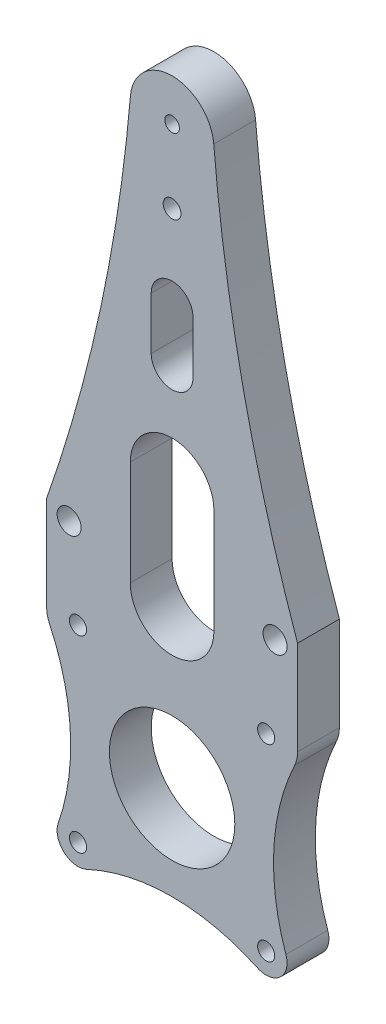
ISO-10303-21;
HEADER;
FILE_DESCRIPTION(('STEP AP214'),'2;1');
FILE_NAME('part.step','',(''),(''),'','','');
FILE_SCHEMA(('AUTOMOTIVE_DESIGN { 1 0 10303 214 1 1 1 1 }'));
ENDSEC;
DATA;
#1=APPLICATION_CONTEXT('core data for automotive mechanical design processes');
#2=APPLICATION_PROTOCOL_DEFINITION('international standard','automotive_design',2000,#1);
#3=PRODUCT_CONTEXT('',#1,'mechanical');
#4=PRODUCT('Part','Part','',(#3));
#5=PRODUCT_RELATED_PRODUCT_CATEGORY('part','',(#4));
#6=PRODUCT_DEFINITION_FORMATION('','',#4);
#7=PRODUCT_DEFINITION_CONTEXT('part definition',#1,'design');
#8=PRODUCT_DEFINITION('design','',#6,#7);
#9=PRODUCT_DEFINITION_SHAPE('','',#8);
#10=(LENGTH_UNIT() NAMED_UNIT(*) SI_UNIT(.MILLI.,.METRE.));
#11=(NAMED_UNIT(*) PLANE_ANGLE_UNIT() SI_UNIT($,.RADIAN.));
#12=(NAMED_UNIT(*) SI_UNIT($,.STERADIAN.) SOLID_ANGLE_UNIT());
#13=UNCERTAINTY_MEASURE_WITH_UNIT(LENGTH_MEASURE(1.E-05),#10,'distance_accuracy_value','');
#14=(GEOMETRIC_REPRESENTATION_CONTEXT(3) GLOBAL_UNCERTAINTY_ASSIGNED_CONTEXT((#13)) GLOBAL_UNIT_ASSIGNED_CONTEXT((#10,
#11,#12)) REPRESENTATION_CONTEXT('',''));
#15=CARTESIAN_POINT('',(0.,0.,0.));
#16=DIRECTION('',(0.,0.,1.));
#17=DIRECTION('',(1.,0.,0.));
#18=AXIS2_PLACEMENT_3D('',#15,#16,#17);
#19=CARTESIAN_POINT('',(0.,-20.,20.));
#20=DIRECTION('',(0.,0.,1.));
#21=DIRECTION('',(1.,0.,0.));
#22=AXIS2_PLACEMENT_3D('',#19,#20,#21);
#23=PLANE('',#22);
#24=CARTESIAN_POINT('',(0.,-20.,20.));
#25=DIRECTION('',(0.,0.,1.));
#26=DIRECTION('',(1.,0.,0.));
#27=AXIS2_PLACEMENT_3D('',#24,#25,#26);
#28=CIRCLE('',#27,3.5);
#29=CARTESIAN_POINT('',(3.5,-20.,20.));
#30=VERTEX_POINT('',#29);
#31=EDGE_CURVE('E618',#30,#30,#28,.T.);
#32=ORIENTED_EDGE('',*,*,#31,.F.);
#33=EDGE_LOOP('',(#32));
#34=FACE_BOUND('',#33,.T.);
#35=CARTESIAN_POINT('',(0.,-55.,20.));
#36=DIRECTION('',(0.,0.,1.));
#37=DIRECTION('',(1.,0.,0.));
#38=AXIS2_PLACEMENT_3D('',#35,#36,#37);
#39=CIRCLE('',#38,4.25);
#40=CARTESIAN_POINT('',(4.25,-55.,20.));
#41=VERTEX_POINT('',#40);
#42=EDGE_CURVE('E220',#41,#41,#39,.T.);
#43=ORIENTED_EDGE('',*,*,#42,.F.);
#44=EDGE_LOOP('',(#43));
#45=FACE_BOUND('',#44,.T.);
#46=CARTESIAN_POINT('',(0.,-120.,20.));
#47=DIRECTION('',(0.,0.,1.));
#48=DIRECTION('',(1.,0.,0.));
#49=AXIS2_PLACEMENT_3D('',#46,#47,#48);
#50=CIRCLE('',#49,10.);
#51=CARTESIAN_POINT('',(-10.,-120.,20.));
#52=VERTEX_POINT('',#51);
#53=CARTESIAN_POINT('',(10.,-120.,20.));
#54=VERTEX_POINT('',#53);
#55=EDGE_CURVE('E70',#52,#54,#50,.T.);
#56=ORIENTED_EDGE('',*,*,#55,.F.);
#57=DIRECTION('',(0.,-1.,0.));
#58=VECTOR('',#57,1.);
#59=CARTESIAN_POINT('',(-10.,-120.,20.));
#60=LINE('',#59,#58);
#61=CARTESIAN_POINT('',(-10.,-94.9999999999999,20.));
#62=VERTEX_POINT('',#61);
#63=EDGE_CURVE('E213',#62,#52,#60,.T.);
#64=ORIENTED_EDGE('',*,*,#63,.F.);
#65=CARTESIAN_POINT('',(0.,-94.9999999999999,20.));
#66=DIRECTION('',(0.,0.,1.));
#67=DIRECTION('',(1.,0.,0.));
#68=AXIS2_PLACEMENT_3D('',#65,#66,#67);
#69=CIRCLE('',#68,10.);
#70=CARTESIAN_POINT('',(10.,-94.9999999999999,20.));
#71=VERTEX_POINT('',#70);
#72=EDGE_CURVE('E217',#71,#62,#69,.T.);
#73=ORIENTED_EDGE('',*,*,#72,.F.);
#74=DIRECTION('',(0.,1.,0.));
#75=VECTOR('',#74,1.);
#76=CARTESIAN_POINT('',(10.,-120.,20.));
#77=LINE('',#76,#75);
#78=EDGE_CURVE('E229',#54,#71,#77,.T.);
#79=ORIENTED_EDGE('',*,*,#78,.F.);
#80=EDGE_LOOP('',(#56,#64,#73,#79));
#81=FACE_BOUND('',#80,.T.);
#82=CARTESIAN_POINT('',(0.,-220.,20.));
#83=DIRECTION('',(0.,0.,1.));
#84=DIRECTION('',(1.,0.,0.));
#85=AXIS2_PLACEMENT_3D('',#82,#83,#84);
#86=CIRCLE('',#85,20.);
#87=CARTESIAN_POINT('',(-20.,-220.,20.));
#88=VERTEX_POINT('',#87);
#89=CARTESIAN_POINT('',(20.,-220.,20.));
#90=VERTEX_POINT('',#89);
#91=EDGE_CURVE('E239',#88,#90,#86,.T.);
#92=ORIENTED_EDGE('',*,*,#91,.F.);
#93=DIRECTION('',(0.,-1.,0.));
#94=VECTOR('',#93,1.);
#95=CARTESIAN_POINT('',(-20.,-220.,20.));
#96=LINE('',#95,#94);
#97=CARTESIAN_POINT('',(-20.,-170.,20.));
#98=VERTEX_POINT('',#97);
#99=EDGE_CURVE('E250',#98,#88,#96,.T.);
#100=ORIENTED_EDGE('',*,*,#99,.F.);
#101=CARTESIAN_POINT('',(0.,-170.,20.));
#102=DIRECTION('',(0.,0.,1.));
#103=DIRECTION('',(1.,0.,0.));
#104=AXIS2_PLACEMENT_3D('',#101,#102,#103);
#105=CIRCLE('',#104,20.);
#106=CARTESIAN_POINT('',(20.,-170.,20.));
#107=VERTEX_POINT('',#106);
#108=EDGE_CURVE('E269',#107,#98,#105,.T.);
#109=ORIENTED_EDGE('',*,*,#108,.F.);
#110=DIRECTION('',(0.,1.,0.));
#111=VECTOR('',#110,1.);
#112=CARTESIAN_POINT('',(20.,-220.,20.));
#113=LINE('',#112,#111);
#114=EDGE_CURVE('E265',#90,#107,#113,.T.);
#115=ORIENTED_EDGE('',*,*,#114,.F.);
#116=EDGE_LOOP('',(#92,#100,#109,#115));
#117=FACE_BOUND('',#116,.T.);
#118=CARTESIAN_POINT('',(0.,-295.,20.));
#119=DIRECTION('',(0.,0.,1.));
#120=DIRECTION('',(1.,0.,0.));
#121=AXIS2_PLACEMENT_3D('',#118,#119,#120);
#122=CIRCLE('',#121,30.);
#123=CARTESIAN_POINT('',(30.,-295.,20.));
#124=VERTEX_POINT('',#123);
#125=EDGE_CURVE('E279',#124,#124,#122,.T.);
#126=ORIENTED_EDGE('',*,*,#125,.F.);
#127=EDGE_LOOP('',(#126));
#128=FACE_BOUND('',#127,.T.);
#129=CARTESIAN_POINT('',(-45.,-250.,20.));
#130=DIRECTION('',(0.,0.,1.));
#131=DIRECTION('',(1.,0.,0.));
#132=AXIS2_PLACEMENT_3D('',#129,#130,#131);
#133=CIRCLE('',#132,4.1);
#134=CARTESIAN_POINT('',(-40.9,-250.,20.));
#135=VERTEX_POINT('',#134);
#136=EDGE_CURVE('E389',#135,#135,#133,.T.);
#137=ORIENTED_EDGE('',*,*,#136,.F.);
#138=EDGE_LOOP('',(#137));
#139=FACE_BOUND('',#138,.T.);
#140=CARTESIAN_POINT('',(0.,-20.,20.));
#141=DIRECTION('',(0.,0.,1.));
#142=DIRECTION('',(1.,0.,0.));
#143=AXIS2_PLACEMENT_3D('',#140,#141,#142);
#144=CIRCLE('',#143,19.9999999999998);
#145=CARTESIAN_POINT('',(19.9262463817534,-18.2839856837292,20.));
#146=VERTEX_POINT('',#145);
#147=CARTESIAN_POINT('',(-19.9262463817534,-18.2839856837292,20.));
#148=VERTEX_POINT('',#147);
#149=EDGE_CURVE('E405',#146,#148,#144,.T.);
#150=ORIENTED_EDGE('',*,*,#149,.T.);
#151=CARTESIAN_POINT('',(-779.879569235867,47.1618969341376,20.));
#152=DIRECTION('',(0.,0.,-1.));
#153=DIRECTION('',(-1.,0.,0.));
#154=AXIS2_PLACEMENT_3D('',#151,#152,#153);
#155=CIRCLE('',#154,762.766161066837);
#156=CARTESIAN_POINT('',(-60.,-205.,20.));
#157=VERTEX_POINT('',#156);
#158=EDGE_CURVE('E409',#148,#157,#155,.T.);
#159=ORIENTED_EDGE('',*,*,#158,.T.);
#160=DIRECTION('',(0.,-1.,0.));
#161=VECTOR('',#160,1.);
#162=CARTESIAN_POINT('',(-60.,-250.,20.));
#163=LINE('',#162,#161);
#164=CARTESIAN_POINT('',(-60.,-250.,20.));
#165=VERTEX_POINT('',#164);
#166=EDGE_CURVE('E413',#157,#165,#163,.T.);
#167=ORIENTED_EDGE('',*,*,#166,.T.);
#168=CARTESIAN_POINT('',(-45.,-250.,20.));
#169=DIRECTION('',(0.,0.,1.));
#170=DIRECTION('',(-1.,0.,0.));
#171=AXIS2_PLACEMENT_3D('',#168,#169,#170);
#172=CIRCLE('',#171,15.);
#173=CARTESIAN_POINT('',(-58.5812321969071,-256.367898555544,20.));
#174=VERTEX_POINT('',#173);
#175=EDGE_CURVE('E416',#165,#174,#172,.T.);
#176=ORIENTED_EDGE('',*,*,#175,.T.);
#177=CARTESIAN_POINT('',(-155.084377389979,-301.615798743888,20.));
#178=DIRECTION('',(0.,0.,-1.));
#179=DIRECTION('',(1.,0.,0.));
#180=AXIS2_PLACEMENT_3D('',#177,#178,#179);
#181=CIRCLE('',#180,106.584377389979);
#182=CARTESIAN_POINT('',(-54.4424638922025,-336.707603358577,20.));
#183=VERTEX_POINT('',#182);
#184=EDGE_CURVE('E419',#174,#183,#181,.T.);
#185=ORIENTED_EDGE('',*,*,#184,.T.);
#186=CARTESIAN_POINT('',(-45.,-340.,20.));
#187=DIRECTION('',(0.,0.,1.));
#188=DIRECTION('',(-1.,0.,0.));
#189=AXIS2_PLACEMENT_3D('',#186,#187,#188);
#190=CIRCLE('',#189,10.);
#191=CARTESIAN_POINT('',(-40.7647058823529,-349.058823529412,20.));
#192=VERTEX_POINT('',#191);
#193=EDGE_CURVE('E422',#183,#192,#190,.T.);
#194=ORIENTED_EDGE('',*,*,#193,.T.);
#195=CARTESIAN_POINT('',(0.,-436.25,20.));
#196=DIRECTION('',(0.,0.,-1.));
#197=DIRECTION('',(1.,0.,0.));
#198=AXIS2_PLACEMENT_3D('',#195,#196,#197);
#199=CIRCLE('',#198,96.25);
#200=CARTESIAN_POINT('',(40.7647058823529,-349.058823529412,20.));
#201=VERTEX_POINT('',#200);
#202=EDGE_CURVE('E425',#192,#201,#199,.T.);
#203=ORIENTED_EDGE('',*,*,#202,.T.);
#204=CARTESIAN_POINT('',(45.,-340.,20.));
#205=DIRECTION('',(0.,0.,-1.));
#206=DIRECTION('',(1.,0.,0.));
#207=AXIS2_PLACEMENT_3D('',#204,#205,#206);
#208=CIRCLE('',#207,10.);
#209=CARTESIAN_POINT('',(54.4424638922025,-336.707603358577,20.));
#210=VERTEX_POINT('',#209);
#211=EDGE_CURVE('E321',#210,#201,#208,.T.);
#212=ORIENTED_EDGE('',*,*,#211,.F.);
#213=CARTESIAN_POINT('',(155.084377389979,-301.615798743888,20.));
#214=DIRECTION('',(0.,0.,1.));
#215=DIRECTION('',(-1.,0.,0.));
#216=AXIS2_PLACEMENT_3D('',#213,#214,#215);
#217=CIRCLE('',#216,106.584377389979);
#218=CARTESIAN_POINT('',(58.5812321969071,-256.367898555544,20.));
#219=VERTEX_POINT('',#218);
#220=EDGE_CURVE('E325',#219,#210,#217,.T.);
#221=ORIENTED_EDGE('',*,*,#220,.F.);
#222=CARTESIAN_POINT('',(45.,-250.,20.));
#223=DIRECTION('',(0.,0.,-1.));
#224=DIRECTION('',(1.,0.,0.));
#225=AXIS2_PLACEMENT_3D('',#222,#223,#224);
#226=CIRCLE('',#225,15.);
#227=CARTESIAN_POINT('',(60.,-250.,20.));
#228=VERTEX_POINT('',#227);
#229=EDGE_CURVE('E330',#228,#219,#226,.T.);
#230=ORIENTED_EDGE('',*,*,#229,.F.);
#231=DIRECTION('',(0.,-1.,0.));
#232=VECTOR('',#231,1.);
#233=CARTESIAN_POINT('',(60.,-250.,20.));
#234=LINE('',#233,#232);
#235=CARTESIAN_POINT('',(60.,-205.,20.));
#236=VERTEX_POINT('',#235);
#237=EDGE_CURVE('E334',#236,#228,#234,.T.);
#238=ORIENTED_EDGE('',*,*,#237,.F.);
#239=CARTESIAN_POINT('',(779.879569235867,47.1618969341376,20.));
#240=DIRECTION('',(0.,0.,1.));
#241=DIRECTION('',(1.,0.,0.));
#242=AXIS2_PLACEMENT_3D('',#239,#240,#241);
#243=CIRCLE('',#242,762.766161066837);
#244=EDGE_CURVE('E338',#146,#236,#243,.T.);
#245=ORIENTED_EDGE('',*,*,#244,.F.);
#246=EDGE_LOOP('',(#150,#159,#167,#176,#185,#194,#203,#212,#221,#230,#238,#245));
#247=FACE_BOUND('',#246,.T.);
#248=CARTESIAN_POINT('',(-45.,-340.,20.));
#249=DIRECTION('',(0.,0.,1.));
#250=DIRECTION('',(1.,0.,0.));
#251=AXIS2_PLACEMENT_3D('',#248,#249,#250);
#252=CIRCLE('',#251,4.1);
#253=CARTESIAN_POINT('',(-40.9,-340.,20.));
#254=VERTEX_POINT('',#253);
#255=EDGE_CURVE('E397',#254,#254,#252,.T.);
#256=ORIENTED_EDGE('',*,*,#255,.F.);
#257=EDGE_LOOP('',(#256));
#258=FACE_BOUND('',#257,.T.);
#259=CARTESIAN_POINT('',(-49.25,-209.,20.));
#260=DIRECTION('',(0.,0.,1.));
#261=DIRECTION('',(1.,0.,0.));
#262=AXIS2_PLACEMENT_3D('',#259,#260,#261);
#263=CIRCLE('',#262,5.75);
#264=CARTESIAN_POINT('',(-43.5,-209.,20.));
#265=VERTEX_POINT('',#264);
#266=EDGE_CURVE('E381',#265,#265,#263,.T.);
#267=ORIENTED_EDGE('',*,*,#266,.F.);
#268=EDGE_LOOP('',(#267));
#269=FACE_BOUND('',#268,.T.);
#270=CARTESIAN_POINT('',(49.25,-209.,20.));
#271=DIRECTION('',(0.,0.,-1.));
#272=DIRECTION('',(-1.,0.,0.));
#273=AXIS2_PLACEMENT_3D('',#270,#271,#272);
#274=CIRCLE('',#273,5.75);
#275=CARTESIAN_POINT('',(43.5,-209.,20.));
#276=VERTEX_POINT('',#275);
#277=EDGE_CURVE('E297',#276,#276,#274,.T.);
#278=ORIENTED_EDGE('',*,*,#277,.T.);
#279=EDGE_LOOP('',(#278));
#280=FACE_BOUND('',#279,.T.);
#281=CARTESIAN_POINT('',(45.,-250.,20.));
#282=DIRECTION('',(0.,0.,-1.));
#283=DIRECTION('',(-1.,0.,0.));
#284=AXIS2_PLACEMENT_3D('',#281,#282,#283);
#285=CIRCLE('',#284,4.1);
#286=CARTESIAN_POINT('',(40.9,-250.,20.));
#287=VERTEX_POINT('',#286);
#288=EDGE_CURVE('E305',#287,#287,#285,.T.);
#289=ORIENTED_EDGE('',*,*,#288,.T.);
#290=EDGE_LOOP('',(#289));
#291=FACE_BOUND('',#290,.T.);
#292=CARTESIAN_POINT('',(45.,-340.,20.));
#293=DIRECTION('',(0.,0.,-1.));
#294=DIRECTION('',(-1.,0.,0.));
#295=AXIS2_PLACEMENT_3D('',#292,#293,#294);
#296=CIRCLE('',#295,4.1);
#297=CARTESIAN_POINT('',(40.9,-340.,20.));
#298=VERTEX_POINT('',#297);
#299=EDGE_CURVE('E313',#298,#298,#296,.T.);
#300=ORIENTED_EDGE('',*,*,#299,.T.);
#301=EDGE_LOOP('',(#300));
#302=FACE_BOUND('',#301,.T.);
#303=ADVANCED_FACE('F54',(#34,#45,#81,#117,#128,#139,#247,#258,#269,#280,#291,#302),#23,.T.);
#304=CARTESIAN_POINT('',(0.,-20.,0.));
#305=DIRECTION('',(0.,0.,1.));
#306=DIRECTION('',(1.,0.,0.));
#307=AXIS2_PLACEMENT_3D('',#304,#305,#306);
#308=PLANE('',#307);
#309=CARTESIAN_POINT('',(0.,-20.,0.));
#310=DIRECTION('',(0.,0.,1.));
#311=DIRECTION('',(1.,0.,0.));
#312=AXIS2_PLACEMENT_3D('',#309,#310,#311);
#313=CIRCLE('',#312,3.5);
#314=CARTESIAN_POINT('',(3.5,-20.,0.));
#315=VERTEX_POINT('',#314);
#316=EDGE_CURVE('E616',#315,#315,#313,.T.);
#317=ORIENTED_EDGE('',*,*,#316,.T.);
#318=EDGE_LOOP('',(#317));
#319=FACE_BOUND('',#318,.T.);
#320=CARTESIAN_POINT('',(0.,-55.,0.));
#321=DIRECTION('',(0.,0.,1.));
#322=DIRECTION('',(1.,0.,0.));
#323=AXIS2_PLACEMENT_3D('',#320,#321,#322);
#324=CIRCLE('',#323,4.25);
#325=CARTESIAN_POINT('',(4.25,-55.,0.));
#326=VERTEX_POINT('',#325);
#327=EDGE_CURVE('E230',#326,#326,#324,.T.);
#328=ORIENTED_EDGE('',*,*,#327,.T.);
#329=EDGE_LOOP('',(#328));
#330=FACE_BOUND('',#329,.T.);
#331=DIRECTION('',(0.,-1.,0.));
#332=VECTOR('',#331,1.);
#333=CARTESIAN_POINT('',(-10.,-120.,0.));
#334=LINE('',#333,#332);
#335=CARTESIAN_POINT('',(-10.,-94.9999999999999,0.));
#336=VERTEX_POINT('',#335);
#337=CARTESIAN_POINT('',(-10.,-120.,0.));
#338=VERTEX_POINT('',#337);
#339=EDGE_CURVE('E201',#336,#338,#334,.T.);
#340=ORIENTED_EDGE('',*,*,#339,.T.);
#341=CARTESIAN_POINT('',(0.,-120.,0.));
#342=DIRECTION('',(0.,0.,1.));
#343=DIRECTION('',(1.,0.,0.));
#344=AXIS2_PLACEMENT_3D('',#341,#342,#343);
#345=CIRCLE('',#344,10.);
#346=CARTESIAN_POINT('',(10.,-120.,0.));
#347=VERTEX_POINT('',#346);
#348=EDGE_CURVE('E194',#338,#347,#345,.T.);
#349=ORIENTED_EDGE('',*,*,#348,.T.);
#350=DIRECTION('',(0.,1.,0.));
#351=VECTOR('',#350,1.);
#352=CARTESIAN_POINT('',(10.,-120.,0.));
#353=LINE('',#352,#351);
#354=CARTESIAN_POINT('',(10.,-94.9999999999999,0.));
#355=VERTEX_POINT('',#354);
#356=EDGE_CURVE('E204',#347,#355,#353,.T.);
#357=ORIENTED_EDGE('',*,*,#356,.T.);
#358=CARTESIAN_POINT('',(0.,-94.9999999999999,0.));
#359=DIRECTION('',(0.,0.,1.));
#360=DIRECTION('',(1.,0.,0.));
#361=AXIS2_PLACEMENT_3D('',#358,#359,#360);
#362=CIRCLE('',#361,10.);
#363=EDGE_CURVE('E78',#355,#336,#362,.T.);
#364=ORIENTED_EDGE('',*,*,#363,.T.);
#365=EDGE_LOOP('',(#340,#349,#357,#364));
#366=FACE_BOUND('',#365,.T.);
#367=DIRECTION('',(0.,-1.,0.));
#368=VECTOR('',#367,1.);
#369=CARTESIAN_POINT('',(-20.,-220.,0.));
#370=LINE('',#369,#368);
#371=CARTESIAN_POINT('',(-20.,-170.,0.));
#372=VERTEX_POINT('',#371);
#373=CARTESIAN_POINT('',(-20.,-220.,0.));
#374=VERTEX_POINT('',#373);
#375=EDGE_CURVE('E258',#372,#374,#370,.T.);
#376=ORIENTED_EDGE('',*,*,#375,.T.);
#377=CARTESIAN_POINT('',(0.,-220.,0.));
#378=DIRECTION('',(0.,0.,1.));
#379=DIRECTION('',(1.,0.,0.));
#380=AXIS2_PLACEMENT_3D('',#377,#378,#379);
#381=CIRCLE('',#380,20.);
#382=CARTESIAN_POINT('',(20.,-220.,0.));
#383=VERTEX_POINT('',#382);
#384=EDGE_CURVE('E245',#374,#383,#381,.T.);
#385=ORIENTED_EDGE('',*,*,#384,.T.);
#386=DIRECTION('',(0.,1.,0.));
#387=VECTOR('',#386,1.);
#388=CARTESIAN_POINT('',(20.,-220.,0.));
#389=LINE('',#388,#387);
#390=CARTESIAN_POINT('',(20.,-170.,0.));
#391=VERTEX_POINT('',#390);
#392=EDGE_CURVE('E249',#383,#391,#389,.T.);
#393=ORIENTED_EDGE('',*,*,#392,.T.);
#394=CARTESIAN_POINT('',(0.,-170.,0.));
#395=DIRECTION('',(0.,0.,1.));
#396=DIRECTION('',(1.,0.,0.));
#397=AXIS2_PLACEMENT_3D('',#394,#395,#396);
#398=CIRCLE('',#397,20.);
#399=EDGE_CURVE('E254',#391,#372,#398,.T.);
#400=ORIENTED_EDGE('',*,*,#399,.T.);
#401=EDGE_LOOP('',(#376,#385,#393,#400));
#402=FACE_BOUND('',#401,.T.);
#403=CARTESIAN_POINT('',(0.,-295.,0.));
#404=DIRECTION('',(0.,0.,1.));
#405=DIRECTION('',(1.,0.,0.));
#406=AXIS2_PLACEMENT_3D('',#403,#404,#405);
#407=CIRCLE('',#406,30.);
#408=CARTESIAN_POINT('',(30.,-295.,0.));
#409=VERTEX_POINT('',#408);
#410=EDGE_CURVE('E289',#409,#409,#407,.T.);
#411=ORIENTED_EDGE('',*,*,#410,.T.);
#412=EDGE_LOOP('',(#411));
#413=FACE_BOUND('',#412,.T.);
#414=CARTESIAN_POINT('',(0.,-20.,0.));
#415=DIRECTION('',(0.,0.,1.));
#416=DIRECTION('',(1.,0.,0.));
#417=AXIS2_PLACEMENT_3D('',#414,#415,#416);
#418=CIRCLE('',#417,19.9999999999998);
#419=CARTESIAN_POINT('',(19.9262463817534,-18.2839856837292,0.));
#420=VERTEX_POINT('',#419);
#421=CARTESIAN_POINT('',(-19.9262463817534,-18.2839856837292,0.));
#422=VERTEX_POINT('',#421);
#423=EDGE_CURVE('E401',#420,#422,#418,.T.);
#424=ORIENTED_EDGE('',*,*,#423,.F.);
#425=CARTESIAN_POINT('',(779.879569235867,47.1618969341376,0.));
#426=DIRECTION('',(0.,0.,1.));
#427=DIRECTION('',(1.,0.,0.));
#428=AXIS2_PLACEMENT_3D('',#425,#426,#427);
#429=CIRCLE('',#428,762.766161066837);
#430=CARTESIAN_POINT('',(60.,-205.,0.));
#431=VERTEX_POINT('',#430);
#432=EDGE_CURVE('E326',#420,#431,#429,.T.);
#433=ORIENTED_EDGE('',*,*,#432,.T.);
#434=DIRECTION('',(0.,-1.,0.));
#435=VECTOR('',#434,1.);
#436=CARTESIAN_POINT('',(60.,-250.,0.));
#437=LINE('',#436,#435);
#438=CARTESIAN_POINT('',(60.,-250.,0.));
#439=VERTEX_POINT('',#438);
#440=EDGE_CURVE('E354',#431,#439,#437,.T.);
#441=ORIENTED_EDGE('',*,*,#440,.T.);
#442=CARTESIAN_POINT('',(45.,-250.,0.));
#443=DIRECTION('',(0.,0.,-1.));
#444=DIRECTION('',(1.,0.,0.));
#445=AXIS2_PLACEMENT_3D('',#442,#443,#444);
#446=CIRCLE('',#445,15.);
#447=CARTESIAN_POINT('',(58.5812321969071,-256.367898555544,0.));
#448=VERTEX_POINT('',#447);
#449=EDGE_CURVE('E350',#439,#448,#446,.T.);
#450=ORIENTED_EDGE('',*,*,#449,.T.);
#451=CARTESIAN_POINT('',(155.084377389979,-301.615798743888,0.));
#452=DIRECTION('',(0.,0.,1.));
#453=DIRECTION('',(-1.,0.,0.));
#454=AXIS2_PLACEMENT_3D('',#451,#452,#453);
#455=CIRCLE('',#454,106.584377389979);
#456=CARTESIAN_POINT('',(54.4424638922025,-336.707603358577,0.));
#457=VERTEX_POINT('',#456);
#458=EDGE_CURVE('E346',#448,#457,#455,.T.);
#459=ORIENTED_EDGE('',*,*,#458,.T.);
#460=CARTESIAN_POINT('',(45.,-340.,0.));
#461=DIRECTION('',(0.,0.,-1.));
#462=DIRECTION('',(1.,0.,0.));
#463=AXIS2_PLACEMENT_3D('',#460,#461,#462);
#464=CIRCLE('',#463,10.);
#465=CARTESIAN_POINT('',(40.7647058823529,-349.058823529412,0.));
#466=VERTEX_POINT('',#465);
#467=EDGE_CURVE('E317',#457,#466,#464,.T.);
#468=ORIENTED_EDGE('',*,*,#467,.T.);
#469=CARTESIAN_POINT('',(0.,-436.25,0.));
#470=DIRECTION('',(0.,0.,-1.));
#471=DIRECTION('',(1.,0.,0.));
#472=AXIS2_PLACEMENT_3D('',#469,#470,#471);
#473=CIRCLE('',#472,96.25);
#474=CARTESIAN_POINT('',(-40.7647058823529,-349.058823529412,0.));
#475=VERTEX_POINT('',#474);
#476=EDGE_CURVE('E410',#475,#466,#473,.T.);
#477=ORIENTED_EDGE('',*,*,#476,.F.);
#478=CARTESIAN_POINT('',(-45.,-340.,0.));
#479=DIRECTION('',(0.,0.,1.));
#480=DIRECTION('',(-1.,0.,0.));
#481=AXIS2_PLACEMENT_3D('',#478,#479,#480);
#482=CIRCLE('',#481,10.);
#483=CARTESIAN_POINT('',(-54.4424638922025,-336.707603358577,0.));
#484=VERTEX_POINT('',#483);
#485=EDGE_CURVE('E444',#484,#475,#482,.T.);
#486=ORIENTED_EDGE('',*,*,#485,.F.);
#487=CARTESIAN_POINT('',(-155.084377389979,-301.615798743888,0.));
#488=DIRECTION('',(0.,0.,-1.));
#489=DIRECTION('',(1.,0.,0.));
#490=AXIS2_PLACEMENT_3D('',#487,#488,#489);
#491=CIRCLE('',#490,106.584377389979);
#492=CARTESIAN_POINT('',(-58.5812321969071,-256.367898555544,0.));
#493=VERTEX_POINT('',#492);
#494=EDGE_CURVE('E441',#493,#484,#491,.T.);
#495=ORIENTED_EDGE('',*,*,#494,.F.);
#496=CARTESIAN_POINT('',(-45.,-250.,0.));
#497=DIRECTION('',(0.,0.,1.));
#498=DIRECTION('',(-1.,0.,0.));
#499=AXIS2_PLACEMENT_3D('',#496,#497,#498);
#500=CIRCLE('',#499,15.);
#501=CARTESIAN_POINT('',(-60.,-250.,0.));
#502=VERTEX_POINT('',#501);
#503=EDGE_CURVE('E438',#502,#493,#500,.T.);
#504=ORIENTED_EDGE('',*,*,#503,.F.);
#505=DIRECTION('',(0.,-1.,0.));
#506=VECTOR('',#505,1.);
#507=CARTESIAN_POINT('',(-60.,-250.,0.));
#508=LINE('',#507,#506);
#509=CARTESIAN_POINT('',(-60.,-205.,0.));
#510=VERTEX_POINT('',#509);
#511=EDGE_CURVE('E435',#510,#502,#508,.T.);
#512=ORIENTED_EDGE('',*,*,#511,.F.);
#513=CARTESIAN_POINT('',(-779.879569235867,47.1618969341376,0.));
#514=DIRECTION('',(0.,0.,-1.));
#515=DIRECTION('',(-1.,0.,0.));
#516=AXIS2_PLACEMENT_3D('',#513,#514,#515);
#517=CIRCLE('',#516,762.766161066837);
#518=EDGE_CURVE('E432',#422,#510,#517,.T.);
#519=ORIENTED_EDGE('',*,*,#518,.F.);
#520=EDGE_LOOP('',(#424,#433,#441,#450,#459,#468,#477,#486,#495,#504,#512,#519));
#521=FACE_BOUND('',#520,.T.);
#522=CARTESIAN_POINT('',(-45.,-340.,0.));
#523=DIRECTION('',(0.,0.,1.));
#524=DIRECTION('',(1.,0.,0.));
#525=AXIS2_PLACEMENT_3D('',#522,#523,#524);
#526=CIRCLE('',#525,4.1);
#527=CARTESIAN_POINT('',(-40.9,-340.,0.));
#528=VERTEX_POINT('',#527);
#529=EDGE_CURVE('E393',#528,#528,#526,.T.);
#530=ORIENTED_EDGE('',*,*,#529,.T.);
#531=EDGE_LOOP('',(#530));
#532=FACE_BOUND('',#531,.T.);
#533=CARTESIAN_POINT('',(-45.,-250.,0.));
#534=DIRECTION('',(0.,0.,1.));
#535=DIRECTION('',(1.,0.,0.));
#536=AXIS2_PLACEMENT_3D('',#533,#534,#535);
#537=CIRCLE('',#536,4.1);
#538=CARTESIAN_POINT('',(-40.9,-250.,0.));
#539=VERTEX_POINT('',#538);
#540=EDGE_CURVE('E385',#539,#539,#537,.T.);
#541=ORIENTED_EDGE('',*,*,#540,.T.);
#542=EDGE_LOOP('',(#541));
#543=FACE_BOUND('',#542,.T.);
#544=CARTESIAN_POINT('',(-49.25,-209.,0.));
#545=DIRECTION('',(0.,0.,1.));
#546=DIRECTION('',(1.,0.,0.));
#547=AXIS2_PLACEMENT_3D('',#544,#545,#546);
#548=CIRCLE('',#547,5.75);
#549=CARTESIAN_POINT('',(-43.5,-209.,0.));
#550=VERTEX_POINT('',#549);
#551=EDGE_CURVE('E380',#550,#550,#548,.T.);
#552=ORIENTED_EDGE('',*,*,#551,.T.);
#553=EDGE_LOOP('',(#552));
#554=FACE_BOUND('',#553,.T.);
#555=CARTESIAN_POINT('',(49.25,-209.,0.));
#556=DIRECTION('',(0.,0.,-1.));
#557=DIRECTION('',(-1.,0.,0.));
#558=AXIS2_PLACEMENT_3D('',#555,#556,#557);
#559=CIRCLE('',#558,5.75);
#560=CARTESIAN_POINT('',(43.5,-209.,0.));
#561=VERTEX_POINT('',#560);
#562=EDGE_CURVE('E293',#561,#561,#559,.T.);
#563=ORIENTED_EDGE('',*,*,#562,.F.);
#564=EDGE_LOOP('',(#563));
#565=FACE_BOUND('',#564,.T.);
#566=CARTESIAN_POINT('',(45.,-250.,0.));
#567=DIRECTION('',(0.,0.,-1.));
#568=DIRECTION('',(-1.,0.,0.));
#569=AXIS2_PLACEMENT_3D('',#566,#567,#568);
#570=CIRCLE('',#569,4.1);
#571=CARTESIAN_POINT('',(40.9,-250.,0.));
#572=VERTEX_POINT('',#571);
#573=EDGE_CURVE('E301',#572,#572,#570,.T.);
#574=ORIENTED_EDGE('',*,*,#573,.F.);
#575=EDGE_LOOP('',(#574));
#576=FACE_BOUND('',#575,.T.);
#577=CARTESIAN_POINT('',(45.,-340.,0.));
#578=DIRECTION('',(0.,0.,-1.));
#579=DIRECTION('',(-1.,0.,0.));
#580=AXIS2_PLACEMENT_3D('',#577,#578,#579);
#581=CIRCLE('',#580,4.1);
#582=CARTESIAN_POINT('',(40.9,-340.,0.));
#583=VERTEX_POINT('',#582);
#584=EDGE_CURVE('E309',#583,#583,#581,.T.);
#585=ORIENTED_EDGE('',*,*,#584,.F.);
#586=EDGE_LOOP('',(#585));
#587=FACE_BOUND('',#586,.T.);
#588=ADVANCED_FACE('F209',(#319,#330,#366,#402,#413,#521,#532,#543,#554,#565,#576,#587),#308,.F.);
#589=CARTESIAN_POINT('',(0.,-20.,20.));
#590=DIRECTION('',(0.,0.,-1.));
#591=DIRECTION('',(-1.,0.,0.));
#592=AXIS2_PLACEMENT_3D('',#589,#590,#591);
#593=CYLINDRICAL_SURFACE('',#592,19.9999999999998);
#594=ORIENTED_EDGE('',*,*,#423,.T.);
#595=DIRECTION('',(0.,0.,-1.));
#596=VECTOR('',#595,1.);
#597=CARTESIAN_POINT('',(-19.9262463817534,-18.2839856837292,20.));
#598=LINE('',#597,#596);
#599=EDGE_CURVE('E13',#148,#422,#598,.T.);
#600=ORIENTED_EDGE('',*,*,#599,.F.);
#601=ORIENTED_EDGE('',*,*,#149,.F.);
#602=DIRECTION('',(0.,0.,-1.));
#603=VECTOR('',#602,1.);
#604=CARTESIAN_POINT('',(19.9262463817534,-18.2839856837292,20.));
#605=LINE('',#604,#603);
#606=EDGE_CURVE('E342',#146,#420,#605,.T.);
#607=ORIENTED_EDGE('',*,*,#606,.T.);
#608=EDGE_LOOP('',(#594,#600,#601,#607));
#609=FACE_BOUND('',#608,.T.);
#610=ADVANCED_FACE('F56',(#609),#593,.T.);
#611=CARTESIAN_POINT('',(-779.879569235867,47.1618969341376,20.));
#612=DIRECTION('',(0.,0.,-1.));
#613=DIRECTION('',(-1.,0.,0.));
#614=AXIS2_PLACEMENT_3D('',#611,#612,#613);
#615=CYLINDRICAL_SURFACE('',#614,762.766161066837);
#616=ORIENTED_EDGE('',*,*,#518,.T.);
#617=DIRECTION('',(0.,0.,-1.));
#618=VECTOR('',#617,1.);
#619=CARTESIAN_POINT('',(-60.,-205.,20.));
#620=LINE('',#619,#618);
#621=EDGE_CURVE('E63',#157,#510,#620,.T.);
#622=ORIENTED_EDGE('',*,*,#621,.F.);
#623=ORIENTED_EDGE('',*,*,#158,.F.);
#624=ORIENTED_EDGE('',*,*,#599,.T.);
#625=EDGE_LOOP('',(#616,#622,#623,#624));
#626=FACE_BOUND('',#625,.T.);
#627=ADVANCED_FACE('F491',(#626),#615,.F.);
#628=CARTESIAN_POINT('',(-60.,-250.,20.));
#629=DIRECTION('',(1.,0.,0.));
#630=DIRECTION('',(0.,1.,0.));
#631=AXIS2_PLACEMENT_3D('',#628,#629,#630);
#632=PLANE('',#631);
#633=ORIENTED_EDGE('',*,*,#511,.T.);
#634=DIRECTION('',(0.,0.,-1.));
#635=VECTOR('',#634,1.);
#636=CARTESIAN_POINT('',(-60.,-250.,20.));
#637=LINE('',#636,#635);
#638=EDGE_CURVE('E460',#165,#502,#637,.T.);
#639=ORIENTED_EDGE('',*,*,#638,.F.);
#640=ORIENTED_EDGE('',*,*,#166,.F.);
#641=ORIENTED_EDGE('',*,*,#621,.T.);
#642=EDGE_LOOP('',(#633,#639,#640,#641));
#643=FACE_BOUND('',#642,.T.);
#644=ADVANCED_FACE('F469',(#643),#632,.F.);
#645=CARTESIAN_POINT('',(-45.,-250.,20.));
#646=DIRECTION('',(0.,0.,-1.));
#647=DIRECTION('',(-1.,0.,0.));
#648=AXIS2_PLACEMENT_3D('',#645,#646,#647);
#649=CYLINDRICAL_SURFACE('',#648,15.);
#650=ORIENTED_EDGE('',*,*,#503,.T.);
#651=DIRECTION('',(0.,0.,-1.));
#652=VECTOR('',#651,1.);
#653=CARTESIAN_POINT('',(-58.5812321969071,-256.367898555544,20.));
#654=LINE('',#653,#652);
#655=EDGE_CURVE('E456',#174,#493,#654,.T.);
#656=ORIENTED_EDGE('',*,*,#655,.F.);
#657=ORIENTED_EDGE('',*,*,#175,.F.);
#658=ORIENTED_EDGE('',*,*,#638,.T.);
#659=EDGE_LOOP('',(#650,#656,#657,#658));
#660=FACE_BOUND('',#659,.T.);
#661=ADVANCED_FACE('F479',(#660),#649,.T.);
#662=CARTESIAN_POINT('',(-155.084377389979,-301.615798743888,20.));
#663=DIRECTION('',(0.,0.,-1.));
#664=DIRECTION('',(-1.,0.,0.));
#665=AXIS2_PLACEMENT_3D('',#662,#663,#664);
#666=CYLINDRICAL_SURFACE('',#665,106.584377389979);
#667=ORIENTED_EDGE('',*,*,#494,.T.);
#668=DIRECTION('',(0.,0.,-1.));
#669=VECTOR('',#668,1.);
#670=CARTESIAN_POINT('',(-54.4424638922025,-336.707603358577,20.));
#671=LINE('',#670,#669);
#672=EDGE_CURVE('E452',#183,#484,#671,.T.);
#673=ORIENTED_EDGE('',*,*,#672,.F.);
#674=ORIENTED_EDGE('',*,*,#184,.F.);
#675=ORIENTED_EDGE('',*,*,#655,.T.);
#676=EDGE_LOOP('',(#667,#673,#674,#675));
#677=FACE_BOUND('',#676,.T.);
#678=ADVANCED_FACE('F483',(#677),#666,.F.);
#679=CARTESIAN_POINT('',(-45.,-340.,20.));
#680=DIRECTION('',(0.,0.,-1.));
#681=DIRECTION('',(-1.,0.,0.));
#682=AXIS2_PLACEMENT_3D('',#679,#680,#681);
#683=CYLINDRICAL_SURFACE('',#682,10.);
#684=ORIENTED_EDGE('',*,*,#485,.T.);
#685=DIRECTION('',(0.,0.,-1.));
#686=VECTOR('',#685,1.);
#687=CARTESIAN_POINT('',(-40.7647058823529,-349.058823529412,20.));
#688=LINE('',#687,#686);
#689=EDGE_CURVE('E428',#192,#475,#688,.T.);
#690=ORIENTED_EDGE('',*,*,#689,.F.);
#691=ORIENTED_EDGE('',*,*,#193,.F.);
#692=ORIENTED_EDGE('',*,*,#672,.T.);
#693=EDGE_LOOP('',(#684,#690,#691,#692));
#694=FACE_BOUND('',#693,.T.);
#695=ADVANCED_FACE('F519',(#694),#683,.T.);
#696=CARTESIAN_POINT('',(0.,-436.25,20.));
#697=DIRECTION('',(0.,0.,-1.));
#698=DIRECTION('',(-1.,0.,0.));
#699=AXIS2_PLACEMENT_3D('',#696,#697,#698);
#700=CYLINDRICAL_SURFACE('',#699,96.25);
#701=ORIENTED_EDGE('',*,*,#476,.T.);
#702=DIRECTION('',(0.,0.,-1.));
#703=VECTOR('',#702,1.);
#704=CARTESIAN_POINT('',(40.7647058823529,-349.058823529412,20.));
#705=LINE('',#704,#703);
#706=EDGE_CURVE('E376',#201,#466,#705,.T.);
#707=ORIENTED_EDGE('',*,*,#706,.F.);
#708=ORIENTED_EDGE('',*,*,#202,.F.);
#709=ORIENTED_EDGE('',*,*,#689,.T.);
#710=EDGE_LOOP('',(#701,#707,#708,#709));
#711=FACE_BOUND('',#710,.T.);
#712=ADVANCED_FACE('F517',(#711),#700,.F.);
#713=CARTESIAN_POINT('',(-45.,-340.,20.));
#714=DIRECTION('',(0.,0.,-1.));
#715=DIRECTION('',(-1.,0.,0.));
#716=AXIS2_PLACEMENT_3D('',#713,#714,#715);
#717=CYLINDRICAL_SURFACE('',#716,4.1);
#718=ORIENTED_EDGE('',*,*,#255,.T.);
#719=EDGE_LOOP('',(#718));
#720=FACE_BOUND('',#719,.T.);
#721=ORIENTED_EDGE('',*,*,#529,.F.);
#722=EDGE_LOOP('',(#721));
#723=FACE_BOUND('',#722,.T.);
#724=ADVANCED_FACE('F526',(#720,#723),#717,.F.);
#725=CARTESIAN_POINT('',(-45.,-250.,20.));
#726=DIRECTION('',(0.,0.,-1.));
#727=DIRECTION('',(-1.,0.,0.));
#728=AXIS2_PLACEMENT_3D('',#725,#726,#727);
#729=CYLINDRICAL_SURFACE('',#728,4.1);
#730=ORIENTED_EDGE('',*,*,#136,.T.);
#731=EDGE_LOOP('',(#730));
#732=FACE_BOUND('',#731,.T.);
#733=ORIENTED_EDGE('',*,*,#540,.F.);
#734=EDGE_LOOP('',(#733));
#735=FACE_BOUND('',#734,.T.);
#736=ADVANCED_FACE('F542',(#732,#735),#729,.F.);
#737=CARTESIAN_POINT('',(-49.25,-209.,20.));
#738=DIRECTION('',(0.,0.,-1.));
#739=DIRECTION('',(-1.,0.,0.));
#740=AXIS2_PLACEMENT_3D('',#737,#738,#739);
#741=CYLINDRICAL_SURFACE('',#740,5.75);
#742=ORIENTED_EDGE('',*,*,#266,.T.);
#743=EDGE_LOOP('',(#742));
#744=FACE_BOUND('',#743,.T.);
#745=ORIENTED_EDGE('',*,*,#551,.F.);
#746=EDGE_LOOP('',(#745));
#747=FACE_BOUND('',#746,.T.);
#748=ADVANCED_FACE('F546',(#744,#747),#741,.F.);
#749=CARTESIAN_POINT('',(45.,-340.,20.));
#750=DIRECTION('',(0.,0.,-1.));
#751=DIRECTION('',(-1.,0.,0.));
#752=AXIS2_PLACEMENT_3D('',#749,#750,#751);
#753=CYLINDRICAL_SURFACE('',#752,10.);
#754=ORIENTED_EDGE('',*,*,#467,.F.);
#755=DIRECTION('',(0.,0.,-1.));
#756=VECTOR('',#755,1.);
#757=CARTESIAN_POINT('',(54.4424638922025,-336.707603358577,20.));
#758=LINE('',#757,#756);
#759=EDGE_CURVE('E373',#210,#457,#758,.T.);
#760=ORIENTED_EDGE('',*,*,#759,.F.);
#761=ORIENTED_EDGE('',*,*,#211,.T.);
#762=ORIENTED_EDGE('',*,*,#706,.T.);
#763=EDGE_LOOP('',(#754,#760,#761,#762));
#764=FACE_BOUND('',#763,.T.);
#765=ADVANCED_FACE('F513',(#764),#753,.T.);
#766=CARTESIAN_POINT('',(155.084377389979,-301.615798743888,20.));
#767=DIRECTION('',(0.,0.,-1.));
#768=DIRECTION('',(-1.,0.,0.));
#769=AXIS2_PLACEMENT_3D('',#766,#767,#768);
#770=CYLINDRICAL_SURFACE('',#769,106.584377389979);
#771=ORIENTED_EDGE('',*,*,#458,.F.);
#772=DIRECTION('',(0.,0.,-1.));
#773=VECTOR('',#772,1.);
#774=CARTESIAN_POINT('',(58.5812321969071,-256.367898555544,20.));
#775=LINE('',#774,#773);
#776=EDGE_CURVE('E370',#219,#448,#775,.T.);
#777=ORIENTED_EDGE('',*,*,#776,.F.);
#778=ORIENTED_EDGE('',*,*,#220,.T.);
#779=ORIENTED_EDGE('',*,*,#759,.T.);
#780=EDGE_LOOP('',(#771,#777,#778,#779));
#781=FACE_BOUND('',#780,.T.);
#782=ADVANCED_FACE('F509',(#781),#770,.F.);
#783=CARTESIAN_POINT('',(45.,-250.,20.));
#784=DIRECTION('',(0.,0.,-1.));
#785=DIRECTION('',(-1.,0.,0.));
#786=AXIS2_PLACEMENT_3D('',#783,#784,#785);
#787=CYLINDRICAL_SURFACE('',#786,15.);
#788=ORIENTED_EDGE('',*,*,#449,.F.);
#789=DIRECTION('',(0.,0.,-1.));
#790=VECTOR('',#789,1.);
#791=CARTESIAN_POINT('',(60.,-250.,20.));
#792=LINE('',#791,#790);
#793=EDGE_CURVE('E367',#228,#439,#792,.T.);
#794=ORIENTED_EDGE('',*,*,#793,.F.);
#795=ORIENTED_EDGE('',*,*,#229,.T.);
#796=ORIENTED_EDGE('',*,*,#776,.T.);
#797=EDGE_LOOP('',(#788,#794,#795,#796));
#798=FACE_BOUND('',#797,.T.);
#799=ADVANCED_FACE('F504',(#798),#787,.T.);
#800=CARTESIAN_POINT('',(60.,-250.,20.));
#801=DIRECTION('',(1.,0.,0.));
#802=DIRECTION('',(0.,1.,0.));
#803=AXIS2_PLACEMENT_3D('',#800,#801,#802);
#804=PLANE('',#803);
#805=ORIENTED_EDGE('',*,*,#440,.F.);
#806=DIRECTION('',(0.,0.,-1.));
#807=VECTOR('',#806,1.);
#808=CARTESIAN_POINT('',(60.,-205.,20.));
#809=LINE('',#808,#807);
#810=EDGE_CURVE('E364',#236,#431,#809,.T.);
#811=ORIENTED_EDGE('',*,*,#810,.F.);
#812=ORIENTED_EDGE('',*,*,#237,.T.);
#813=ORIENTED_EDGE('',*,*,#793,.T.);
#814=EDGE_LOOP('',(#805,#811,#812,#813));
#815=FACE_BOUND('',#814,.T.);
#816=ADVANCED_FACE('F500',(#815),#804,.T.);
#817=CARTESIAN_POINT('',(779.879569235867,47.1618969341376,20.));
#818=DIRECTION('',(0.,0.,-1.));
#819=DIRECTION('',(-1.,0.,0.));
#820=AXIS2_PLACEMENT_3D('',#817,#818,#819);
#821=CYLINDRICAL_SURFACE('',#820,762.766161066837);
#822=ORIENTED_EDGE('',*,*,#432,.F.);
#823=ORIENTED_EDGE('',*,*,#606,.F.);
#824=ORIENTED_EDGE('',*,*,#244,.T.);
#825=ORIENTED_EDGE('',*,*,#810,.T.);
#826=EDGE_LOOP('',(#822,#823,#824,#825));
#827=FACE_BOUND('',#826,.T.);
#828=ADVANCED_FACE('F497',(#827),#821,.F.);
#829=CARTESIAN_POINT('',(45.,-340.,20.));
#830=DIRECTION('',(0.,0.,-1.));
#831=DIRECTION('',(-1.,0.,0.));
#832=AXIS2_PLACEMENT_3D('',#829,#830,#831);
#833=CYLINDRICAL_SURFACE('',#832,4.1);
#834=ORIENTED_EDGE('',*,*,#299,.F.);
#835=EDGE_LOOP('',(#834));
#836=FACE_BOUND('',#835,.T.);
#837=ORIENTED_EDGE('',*,*,#584,.T.);
#838=EDGE_LOOP('',(#837));
#839=FACE_BOUND('',#838,.T.);
#840=ADVANCED_FACE('F561',(#836,#839),#833,.F.);
#841=CARTESIAN_POINT('',(45.,-250.,20.));
#842=DIRECTION('',(0.,0.,-1.));
#843=DIRECTION('',(-1.,0.,0.));
#844=AXIS2_PLACEMENT_3D('',#841,#842,#843);
#845=CYLINDRICAL_SURFACE('',#844,4.1);
#846=ORIENTED_EDGE('',*,*,#288,.F.);
#847=EDGE_LOOP('',(#846));
#848=FACE_BOUND('',#847,.T.);
#849=ORIENTED_EDGE('',*,*,#573,.T.);
#850=EDGE_LOOP('',(#849));
#851=FACE_BOUND('',#850,.T.);
#852=ADVANCED_FACE('F564',(#848,#851),#845,.F.);
#853=CARTESIAN_POINT('',(49.25,-209.,20.));
#854=DIRECTION('',(0.,0.,-1.));
#855=DIRECTION('',(-1.,0.,0.));
#856=AXIS2_PLACEMENT_3D('',#853,#854,#855);
#857=CYLINDRICAL_SURFACE('',#856,5.75);
#858=ORIENTED_EDGE('',*,*,#277,.F.);
#859=EDGE_LOOP('',(#858));
#860=FACE_BOUND('',#859,.T.);
#861=ORIENTED_EDGE('',*,*,#562,.T.);
#862=EDGE_LOOP('',(#861));
#863=FACE_BOUND('',#862,.T.);
#864=ADVANCED_FACE('F568',(#860,#863),#857,.F.);
#865=CARTESIAN_POINT('',(0.,-295.,0.));
#866=DIRECTION('',(0.,0.,1.));
#867=DIRECTION('',(1.,0.,0.));
#868=AXIS2_PLACEMENT_3D('',#865,#866,#867);
#869=CYLINDRICAL_SURFACE('',#868,30.);
#870=ORIENTED_EDGE('',*,*,#410,.F.);
#871=EDGE_LOOP('',(#870));
#872=FACE_BOUND('',#871,.T.);
#873=ORIENTED_EDGE('',*,*,#125,.T.);
#874=EDGE_LOOP('',(#873));
#875=FACE_BOUND('',#874,.T.);
#876=ADVANCED_FACE('F572',(#872,#875),#869,.F.);
#877=CARTESIAN_POINT('',(0.,-220.,0.));
#878=DIRECTION('',(0.,0.,1.));
#879=DIRECTION('',(1.,0.,0.));
#880=AXIS2_PLACEMENT_3D('',#877,#878,#879);
#881=CYLINDRICAL_SURFACE('',#880,20.);
#882=ORIENTED_EDGE('',*,*,#91,.T.);
#883=DIRECTION('',(0.,0.,1.));
#884=VECTOR('',#883,1.);
#885=CARTESIAN_POINT('',(20.,-220.,0.));
#886=LINE('',#885,#884);
#887=EDGE_CURVE('E262',#383,#90,#886,.T.);
#888=ORIENTED_EDGE('',*,*,#887,.F.);
#889=ORIENTED_EDGE('',*,*,#384,.F.);
#890=DIRECTION('',(0.,0.,1.));
#891=VECTOR('',#890,1.);
#892=CARTESIAN_POINT('',(-20.,-220.,0.));
#893=LINE('',#892,#891);
#894=EDGE_CURVE('E276',#374,#88,#893,.T.);
#895=ORIENTED_EDGE('',*,*,#894,.T.);
#896=EDGE_LOOP('',(#882,#888,#889,#895));
#897=FACE_BOUND('',#896,.T.);
#898=ADVANCED_FACE('F576',(#897),#881,.F.);
#899=CARTESIAN_POINT('',(-20.,-220.,0.));
#900=DIRECTION('',(-1.,0.,0.));
#901=DIRECTION('',(0.,0.,1.));
#902=AXIS2_PLACEMENT_3D('',#899,#900,#901);
#903=PLANE('',#902);
#904=ORIENTED_EDGE('',*,*,#99,.T.);
#905=ORIENTED_EDGE('',*,*,#894,.F.);
#906=ORIENTED_EDGE('',*,*,#375,.F.);
#907=DIRECTION('',(0.,0.,1.));
#908=VECTOR('',#907,1.);
#909=CARTESIAN_POINT('',(-20.,-170.,0.));
#910=LINE('',#909,#908);
#911=EDGE_CURVE('E280',#372,#98,#910,.T.);
#912=ORIENTED_EDGE('',*,*,#911,.T.);
#913=EDGE_LOOP('',(#904,#905,#906,#912));
#914=FACE_BOUND('',#913,.T.);
#915=ADVANCED_FACE('F580',(#914),#903,.F.);
#916=CARTESIAN_POINT('',(0.,-170.,0.));
#917=DIRECTION('',(0.,0.,1.));
#918=DIRECTION('',(1.,0.,0.));
#919=AXIS2_PLACEMENT_3D('',#916,#917,#918);
#920=CYLINDRICAL_SURFACE('',#919,20.);
#921=ORIENTED_EDGE('',*,*,#108,.T.);
#922=ORIENTED_EDGE('',*,*,#911,.F.);
#923=ORIENTED_EDGE('',*,*,#399,.F.);
#924=DIRECTION('',(0.,0.,1.));
#925=VECTOR('',#924,1.);
#926=CARTESIAN_POINT('',(20.,-170.,0.));
#927=LINE('',#926,#925);
#928=EDGE_CURVE('E283',#391,#107,#927,.T.);
#929=ORIENTED_EDGE('',*,*,#928,.T.);
#930=EDGE_LOOP('',(#921,#922,#923,#929));
#931=FACE_BOUND('',#930,.T.);
#932=ADVANCED_FACE('F585',(#931),#920,.F.);
#933=CARTESIAN_POINT('',(20.,-220.,0.));
#934=DIRECTION('',(1.,0.,0.));
#935=DIRECTION('',(0.,0.,-1.));
#936=AXIS2_PLACEMENT_3D('',#933,#934,#935);
#937=PLANE('',#936);
#938=ORIENTED_EDGE('',*,*,#114,.T.);
#939=ORIENTED_EDGE('',*,*,#928,.F.);
#940=ORIENTED_EDGE('',*,*,#392,.F.);
#941=ORIENTED_EDGE('',*,*,#887,.T.);
#942=EDGE_LOOP('',(#938,#939,#940,#941));
#943=FACE_BOUND('',#942,.T.);
#944=ADVANCED_FACE('F582',(#943),#937,.F.);
#945=CARTESIAN_POINT('',(0.,-120.,0.));
#946=DIRECTION('',(0.,0.,1.));
#947=DIRECTION('',(1.,0.,0.));
#948=AXIS2_PLACEMENT_3D('',#945,#946,#947);
#949=CYLINDRICAL_SURFACE('',#948,10.);
#950=ORIENTED_EDGE('',*,*,#55,.T.);
#951=DIRECTION('',(0.,0.,1.));
#952=VECTOR('',#951,1.);
#953=CARTESIAN_POINT('',(10.,-120.,0.));
#954=LINE('',#953,#952);
#955=EDGE_CURVE('E190',#347,#54,#954,.T.);
#956=ORIENTED_EDGE('',*,*,#955,.F.);
#957=ORIENTED_EDGE('',*,*,#348,.F.);
#958=DIRECTION('',(0.,0.,1.));
#959=VECTOR('',#958,1.);
#960=CARTESIAN_POINT('',(-10.,-120.,0.));
#961=LINE('',#960,#959);
#962=EDGE_CURVE('E236',#338,#52,#961,.T.);
#963=ORIENTED_EDGE('',*,*,#962,.T.);
#964=EDGE_LOOP('',(#950,#956,#957,#963));
#965=FACE_BOUND('',#964,.T.);
#966=ADVANCED_FACE('F192',(#965),#949,.F.);
#967=CARTESIAN_POINT('',(-10.,-120.,0.));
#968=DIRECTION('',(-1.,0.,0.));
#969=DIRECTION('',(0.,0.,1.));
#970=AXIS2_PLACEMENT_3D('',#967,#968,#969);
#971=PLANE('',#970);
#972=ORIENTED_EDGE('',*,*,#63,.T.);
#973=ORIENTED_EDGE('',*,*,#962,.F.);
#974=ORIENTED_EDGE('',*,*,#339,.F.);
#975=DIRECTION('',(0.,0.,1.));
#976=VECTOR('',#975,1.);
#977=CARTESIAN_POINT('',(-10.,-94.9999999999999,0.));
#978=LINE('',#977,#976);
#979=EDGE_CURVE('E240',#336,#62,#978,.T.);
#980=ORIENTED_EDGE('',*,*,#979,.T.);
#981=EDGE_LOOP('',(#972,#973,#974,#980));
#982=FACE_BOUND('',#981,.T.);
#983=ADVANCED_FACE('F595',(#982),#971,.F.);
#984=CARTESIAN_POINT('',(0.,-94.9999999999999,0.));
#985=DIRECTION('',(0.,0.,1.));
#986=DIRECTION('',(1.,0.,0.));
#987=AXIS2_PLACEMENT_3D('',#984,#985,#986);
#988=CYLINDRICAL_SURFACE('',#987,10.);
#989=ORIENTED_EDGE('',*,*,#72,.T.);
#990=ORIENTED_EDGE('',*,*,#979,.F.);
#991=ORIENTED_EDGE('',*,*,#363,.F.);
#992=DIRECTION('',(0.,0.,1.));
#993=VECTOR('',#992,1.);
#994=CARTESIAN_POINT('',(10.,-94.9999999999999,0.));
#995=LINE('',#994,#993);
#996=EDGE_CURVE('E200',#355,#71,#995,.T.);
#997=ORIENTED_EDGE('',*,*,#996,.T.);
#998=EDGE_LOOP('',(#989,#990,#991,#997));
#999=FACE_BOUND('',#998,.T.);
#1000=ADVANCED_FACE('F599',(#999),#988,.F.);
#1001=CARTESIAN_POINT('',(10.,-120.,0.));
#1002=DIRECTION('',(1.,0.,0.));
#1003=DIRECTION('',(0.,0.,-1.));
#1004=AXIS2_PLACEMENT_3D('',#1001,#1002,#1003);
#1005=PLANE('',#1004);
#1006=ORIENTED_EDGE('',*,*,#78,.T.);
#1007=ORIENTED_EDGE('',*,*,#996,.F.);
#1008=ORIENTED_EDGE('',*,*,#356,.F.);
#1009=ORIENTED_EDGE('',*,*,#955,.T.);
#1010=EDGE_LOOP('',(#1006,#1007,#1008,#1009));
#1011=FACE_BOUND('',#1010,.T.);
#1012=ADVANCED_FACE('F205',(#1011),#1005,.F.);
#1013=CARTESIAN_POINT('',(0.,-55.,0.));
#1014=DIRECTION('',(0.,0.,1.));
#1015=DIRECTION('',(1.,0.,0.));
#1016=AXIS2_PLACEMENT_3D('',#1013,#1014,#1015);
#1017=CYLINDRICAL_SURFACE('',#1016,4.25);
#1018=ORIENTED_EDGE('',*,*,#327,.F.);
#1019=EDGE_LOOP('',(#1018));
#1020=FACE_BOUND('',#1019,.T.);
#1021=ORIENTED_EDGE('',*,*,#42,.T.);
#1022=EDGE_LOOP('',(#1021));
#1023=FACE_BOUND('',#1022,.T.);
#1024=ADVANCED_FACE('F598',(#1020,#1023),#1017,.F.);
#1025=CARTESIAN_POINT('',(0.,-20.,20.));
#1026=DIRECTION('',(0.,0.,1.));
#1027=DIRECTION('',(1.,0.,0.));
#1028=AXIS2_PLACEMENT_3D('',#1025,#1026,#1027);
#1029=CYLINDRICAL_SURFACE('',#1028,3.5);
#1030=ORIENTED_EDGE('',*,*,#316,.F.);
#1031=EDGE_LOOP('',(#1030));
#1032=FACE_BOUND('',#1031,.T.);
#1033=ORIENTED_EDGE('',*,*,#31,.T.);
#1034=EDGE_LOOP('',(#1033));
#1035=FACE_BOUND('',#1034,.T.);
#1036=ADVANCED_FACE('F607',(#1032,#1035),#1029,.F.);
#1037=CLOSED_SHELL('',(#303,#588,#610,#627,#644,#661,#678,#695,#712,#724,#736,#748,#765,#782,
#799,#816,#828,#840,#852,#864,#876,#898,#915,#932,#944,#966,#983,#1000,#1012,#1024,#1036));
#1038=MANIFOLD_SOLID_BREP('B2',#1037);
#1039=ADVANCED_BREP_SHAPE_REPRESENTATION('',(#18,#1038),#14);
#1040=SHAPE_DEFINITION_REPRESENTATION(#9,#1039);
ENDSEC;
END-ISO-10303-21;
